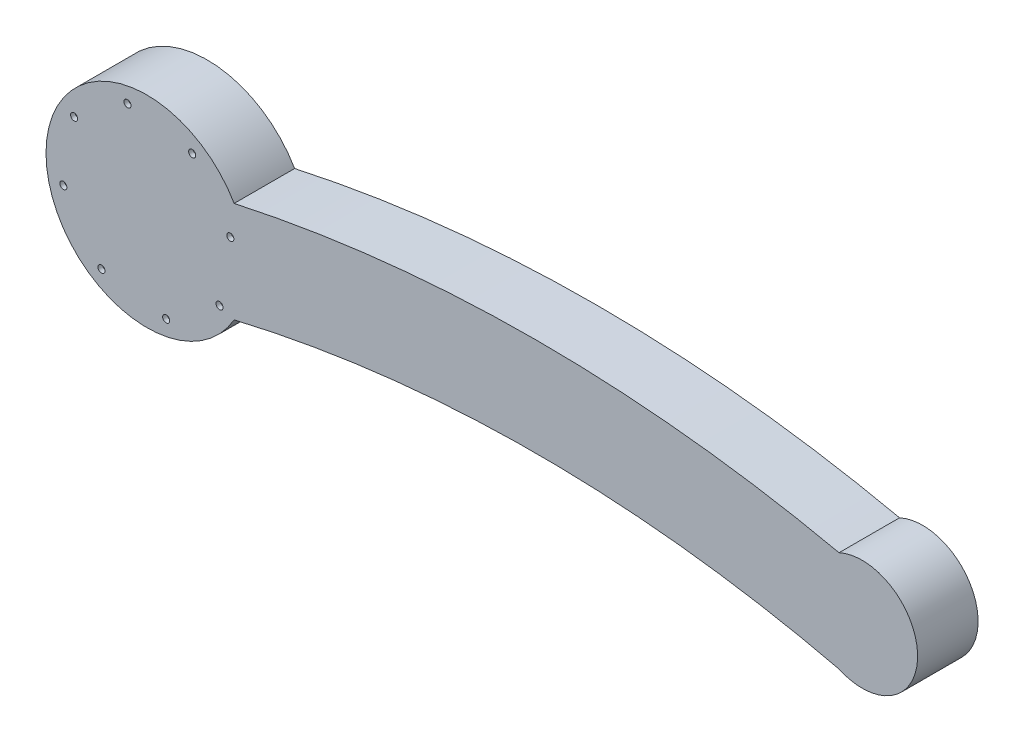
ISO-10303-21;
HEADER;
FILE_DESCRIPTION(('STEP AP214'),'2;1');
FILE_NAME('part.step','',(''),(''),'','','');
FILE_SCHEMA(('AUTOMOTIVE_DESIGN { 1 0 10303 214 1 1 1 1 }'));
ENDSEC;
DATA;
#1=APPLICATION_CONTEXT('core data for automotive mechanical design processes');
#2=APPLICATION_PROTOCOL_DEFINITION('international standard','automotive_design',2000,#1);
#3=PRODUCT_CONTEXT('',#1,'mechanical');
#4=PRODUCT('Part','Part','',(#3));
#5=PRODUCT_RELATED_PRODUCT_CATEGORY('part','',(#4));
#6=PRODUCT_DEFINITION_FORMATION('','',#4);
#7=PRODUCT_DEFINITION_CONTEXT('part definition',#1,'design');
#8=PRODUCT_DEFINITION('design','',#6,#7);
#9=PRODUCT_DEFINITION_SHAPE('','',#8);
#10=(LENGTH_UNIT() NAMED_UNIT(*) SI_UNIT(.MILLI.,.METRE.));
#11=(NAMED_UNIT(*) PLANE_ANGLE_UNIT() SI_UNIT($,.RADIAN.));
#12=(NAMED_UNIT(*) SI_UNIT($,.STERADIAN.) SOLID_ANGLE_UNIT());
#13=UNCERTAINTY_MEASURE_WITH_UNIT(LENGTH_MEASURE(1.E-05),#10,'distance_accuracy_value','');
#14=(GEOMETRIC_REPRESENTATION_CONTEXT(3) GLOBAL_UNCERTAINTY_ASSIGNED_CONTEXT((#13)) GLOBAL_UNIT_ASSIGNED_CONTEXT((#10,
#11,#12)) REPRESENTATION_CONTEXT('',''));
#15=CARTESIAN_POINT('',(0.,0.,0.));
#16=DIRECTION('',(0.,0.,1.));
#17=DIRECTION('',(1.,0.,0.));
#18=AXIS2_PLACEMENT_3D('',#15,#16,#17);
#19=CARTESIAN_POINT('',(161.45643923739,0.,30.));
#20=DIRECTION('',(0.,0.,-1.));
#21=DIRECTION('',(-1.,0.,0.));
#22=AXIS2_PLACEMENT_3D('',#19,#20,#21);
#23=CYLINDRICAL_SURFACE('',#22,27.5);
#24=CARTESIAN_POINT('',(161.45643923739,0.,0.));
#25=DIRECTION('',(0.,0.,1.));
#26=DIRECTION('',(1.,0.,0.));
#27=AXIS2_PLACEMENT_3D('',#24,#25,#26);
#28=CIRCLE('',#27,27.5);
#29=CARTESIAN_POINT('',(150.,-25.,0.));
#30=VERTEX_POINT('',#29);
#31=CARTESIAN_POINT('',(150.,25.,0.));
#32=VERTEX_POINT('',#31);
#33=EDGE_CURVE('E147',#30,#32,#28,.T.);
#34=ORIENTED_EDGE('',*,*,#33,.T.);
#35=DIRECTION('',(0.,0.,-1.));
#36=VECTOR('',#35,1.);
#37=CARTESIAN_POINT('',(150.,25.,30.));
#38=LINE('',#37,#36);
#39=CARTESIAN_POINT('',(150.,25.,30.));
#40=VERTEX_POINT('',#39);
#41=EDGE_CURVE('E11',#40,#32,#38,.T.);
#42=ORIENTED_EDGE('',*,*,#41,.F.);
#43=CARTESIAN_POINT('',(161.45643923739,0.,30.));
#44=DIRECTION('',(0.,0.,1.));
#45=DIRECTION('',(1.,0.,0.));
#46=AXIS2_PLACEMENT_3D('',#43,#44,#45);
#47=CIRCLE('',#46,27.5);
#48=CARTESIAN_POINT('',(150.,-25.,30.));
#49=VERTEX_POINT('',#48);
#50=EDGE_CURVE('E89',#49,#40,#47,.T.);
#51=ORIENTED_EDGE('',*,*,#50,.F.);
#52=DIRECTION('',(0.,0.,-1.));
#53=VECTOR('',#52,1.);
#54=CARTESIAN_POINT('',(150.,-25.,30.));
#55=LINE('',#54,#53);
#56=EDGE_CURVE('E158',#49,#30,#55,.T.);
#57=ORIENTED_EDGE('',*,*,#56,.T.);
#58=EDGE_LOOP('',(#34,#42,#51,#57));
#59=FACE_BOUND('',#58,.T.);
#60=ADVANCED_FACE('F41',(#59),#23,.T.);
#61=CARTESIAN_POINT('',(0.,-658.739716558867,30.));
#62=DIRECTION('',(0.,0.,-1.));
#63=DIRECTION('',(-1.,0.,0.));
#64=AXIS2_PLACEMENT_3D('',#61,#62,#63);
#65=CYLINDRICAL_SURFACE('',#64,700.);
#66=CARTESIAN_POINT('',(0.,-658.739716558867,0.));
#67=DIRECTION('',(0.,0.,1.));
#68=DIRECTION('',(1.,0.,0.));
#69=AXIS2_PLACEMENT_3D('',#66,#67,#68);
#70=CIRCLE('',#69,700.);
#71=CARTESIAN_POINT('',(-150.,25.,0.));
#72=VERTEX_POINT('',#71);
#73=EDGE_CURVE('E161',#72,#32,#70,.F.);
#74=ORIENTED_EDGE('',*,*,#73,.F.);
#75=DIRECTION('',(0.,0.,-1.));
#76=VECTOR('',#75,1.);
#77=CARTESIAN_POINT('',(-150.,25.,30.));
#78=LINE('',#77,#76);
#79=CARTESIAN_POINT('',(-150.,25.,30.));
#80=VERTEX_POINT('',#79);
#81=EDGE_CURVE('E48',#80,#72,#78,.T.);
#82=ORIENTED_EDGE('',*,*,#81,.F.);
#83=CARTESIAN_POINT('',(0.,-658.739716558867,30.));
#84=DIRECTION('',(0.,0.,1.));
#85=DIRECTION('',(1.,0.,0.));
#86=AXIS2_PLACEMENT_3D('',#83,#84,#85);
#87=CIRCLE('',#86,700.);
#88=EDGE_CURVE('E152',#80,#40,#87,.F.);
#89=ORIENTED_EDGE('',*,*,#88,.T.);
#90=ORIENTED_EDGE('',*,*,#41,.T.);
#91=EDGE_LOOP('',(#74,#82,#89,#90));
#92=FACE_BOUND('',#91,.T.);
#93=ADVANCED_FACE('F179',(#92),#65,.T.);
#94=CARTESIAN_POINT('',(-193.301270189222,0.,30.));
#95=DIRECTION('',(0.,0.,-1.));
#96=DIRECTION('',(-1.,0.,0.));
#97=AXIS2_PLACEMENT_3D('',#94,#95,#96);
#98=CYLINDRICAL_SURFACE('',#97,50.);
#99=CARTESIAN_POINT('',(-193.301270189222,0.,0.));
#100=DIRECTION('',(0.,0.,1.));
#101=DIRECTION('',(1.,0.,0.));
#102=AXIS2_PLACEMENT_3D('',#99,#100,#101);
#103=CIRCLE('',#102,50.);
#104=CARTESIAN_POINT('',(-150.,-25.,0.));
#105=VERTEX_POINT('',#104);
#106=EDGE_CURVE('E164',#72,#105,#103,.T.);
#107=ORIENTED_EDGE('',*,*,#106,.T.);
#108=DIRECTION('',(0.,0.,-1.));
#109=VECTOR('',#108,1.);
#110=CARTESIAN_POINT('',(-150.,-25.,30.));
#111=LINE('',#110,#109);
#112=CARTESIAN_POINT('',(-150.,-25.,30.));
#113=VERTEX_POINT('',#112);
#114=EDGE_CURVE('E168',#113,#105,#111,.T.);
#115=ORIENTED_EDGE('',*,*,#114,.F.);
#116=CARTESIAN_POINT('',(-193.301270189222,0.,30.));
#117=DIRECTION('',(0.,0.,1.));
#118=DIRECTION('',(1.,0.,0.));
#119=AXIS2_PLACEMENT_3D('',#116,#117,#118);
#120=CIRCLE('',#119,50.);
#121=EDGE_CURVE('E155',#80,#113,#120,.T.);
#122=ORIENTED_EDGE('',*,*,#121,.F.);
#123=ORIENTED_EDGE('',*,*,#81,.T.);
#124=EDGE_LOOP('',(#107,#115,#122,#123));
#125=FACE_BOUND('',#124,.T.);
#126=ADVANCED_FACE('F172',(#125),#98,.T.);
#127=CARTESIAN_POINT('',(0.,-657.455532033676,30.));
#128=DIRECTION('',(0.,0.,-1.));
#129=DIRECTION('',(-1.,0.,0.));
#130=AXIS2_PLACEMENT_3D('',#127,#128,#129);
#131=CYLINDRICAL_SURFACE('',#130,650.);
#132=CARTESIAN_POINT('',(0.,-657.455532033676,0.));
#133=DIRECTION('',(0.,0.,1.));
#134=DIRECTION('',(1.,0.,0.));
#135=AXIS2_PLACEMENT_3D('',#132,#133,#134);
#136=CIRCLE('',#135,650.);
#137=EDGE_CURVE('E84',#105,#30,#136,.F.);
#138=ORIENTED_EDGE('',*,*,#137,.T.);
#139=ORIENTED_EDGE('',*,*,#56,.F.);
#140=CARTESIAN_POINT('',(0.,-657.455532033676,30.));
#141=DIRECTION('',(0.,0.,1.));
#142=DIRECTION('',(1.,0.,0.));
#143=AXIS2_PLACEMENT_3D('',#140,#141,#142);
#144=CIRCLE('',#143,650.);
#145=EDGE_CURVE('E64',#113,#49,#144,.F.);
#146=ORIENTED_EDGE('',*,*,#145,.F.);
#147=ORIENTED_EDGE('',*,*,#114,.T.);
#148=EDGE_LOOP('',(#138,#139,#146,#147));
#149=FACE_BOUND('',#148,.T.);
#150=ADVANCED_FACE('F181',(#149),#131,.F.);
#151=CARTESIAN_POINT('',(0.,0.,30.));
#152=DIRECTION('',(0.,0.,1.));
#153=DIRECTION('',(1.,0.,0.));
#154=AXIS2_PLACEMENT_3D('',#151,#152,#153);
#155=PLANE('',#154);
#156=CARTESIAN_POINT('',(-151.896300525084,9.58532665650083,30.));
#157=DIRECTION('',(0.,0.,-1.));
#158=DIRECTION('',(-1.,0.,0.));
#159=AXIS2_PLACEMENT_3D('',#156,#157,#158);
#160=CIRCLE('',#159,1.75000000000001);
#161=CARTESIAN_POINT('',(-153.646300525084,9.58532665650083,30.));
#162=VERTEX_POINT('',#161);
#163=EDGE_CURVE('E143',#162,#162,#160,.T.);
#164=ORIENTED_EDGE('',*,*,#163,.T.);
#165=EDGE_LOOP('',(#164));
#166=FACE_BOUND('',#165,.T.);
#167=CARTESIAN_POINT('',(-157.245685886187,-22.4998853456347,30.));
#168=DIRECTION('',(0.,0.,-1.));
#169=DIRECTION('',(-1.,0.,0.));
#170=AXIS2_PLACEMENT_3D('',#167,#168,#169);
#171=CIRCLE('',#170,1.75);
#172=CARTESIAN_POINT('',(-158.995685886187,-22.4998853456347,30.));
#173=VERTEX_POINT('',#172);
#174=EDGE_CURVE('E378',#173,#173,#171,.T.);
#175=ORIENTED_EDGE('',*,*,#174,.T.);
#176=EDGE_LOOP('',(#175));
#177=FACE_BOUND('',#176,.T.);
#178=CARTESIAN_POINT('',(-183.715943532721,-41.4049696641373,30.));
#179=DIRECTION('',(0.,0.,-1.));
#180=DIRECTION('',(-1.,0.,0.));
#181=AXIS2_PLACEMENT_3D('',#178,#179,#180);
#182=CIRCLE('',#181,1.75);
#183=CARTESIAN_POINT('',(-185.465943532721,-41.4049696641373,30.));
#184=VERTEX_POINT('',#183);
#185=EDGE_CURVE('E386',#184,#184,#182,.T.);
#186=ORIENTED_EDGE('',*,*,#185,.T.);
#187=EDGE_LOOP('',(#186));
#188=FACE_BOUND('',#187,.T.);
#189=CARTESIAN_POINT('',(-215.801155534857,-36.0555843030344,30.));
#190=DIRECTION('',(0.,0.,-1.));
#191=DIRECTION('',(-1.,0.,0.));
#192=AXIS2_PLACEMENT_3D('',#189,#190,#191);
#193=CIRCLE('',#192,1.75000000000002);
#194=CARTESIAN_POINT('',(-217.551155534858,-36.0555843030344,30.));
#195=VERTEX_POINT('',#194);
#196=EDGE_CURVE('E392',#195,#195,#193,.T.);
#197=ORIENTED_EDGE('',*,*,#196,.T.);
#198=EDGE_LOOP('',(#197));
#199=FACE_BOUND('',#198,.T.);
#200=CARTESIAN_POINT('',(-234.70623985336,-9.58532665649994,30.));
#201=DIRECTION('',(0.,0.,-1.));
#202=DIRECTION('',(-1.,0.,0.));
#203=AXIS2_PLACEMENT_3D('',#200,#201,#202);
#204=CIRCLE('',#203,1.75000000000003);
#205=CARTESIAN_POINT('',(-236.45623985336,-9.58532665649994,30.));
#206=VERTEX_POINT('',#205);
#207=EDGE_CURVE('E398',#206,#206,#204,.T.);
#208=ORIENTED_EDGE('',*,*,#207,.T.);
#209=EDGE_LOOP('',(#208));
#210=FACE_BOUND('',#209,.T.);
#211=CARTESIAN_POINT('',(-229.356854492257,22.4998853456361,30.));
#212=DIRECTION('',(0.,0.,-1.));
#213=DIRECTION('',(-1.,0.,0.));
#214=AXIS2_PLACEMENT_3D('',#211,#212,#213);
#215=CIRCLE('',#214,1.75000000000001);
#216=CARTESIAN_POINT('',(-231.106854492257,22.4998853456361,30.));
#217=VERTEX_POINT('',#216);
#218=EDGE_CURVE('E404',#217,#217,#215,.T.);
#219=ORIENTED_EDGE('',*,*,#218,.T.);
#220=EDGE_LOOP('',(#219));
#221=FACE_BOUND('',#220,.T.);
#222=CARTESIAN_POINT('',(-202.886596845722,41.4049696641386,30.));
#223=DIRECTION('',(0.,0.,-1.));
#224=DIRECTION('',(-1.,0.,0.));
#225=AXIS2_PLACEMENT_3D('',#222,#223,#224);
#226=CIRCLE('',#225,1.75000000000001);
#227=CARTESIAN_POINT('',(-204.636596845722,41.4049696641386,30.));
#228=VERTEX_POINT('',#227);
#229=EDGE_CURVE('E410',#228,#228,#226,.T.);
#230=ORIENTED_EDGE('',*,*,#229,.T.);
#231=EDGE_LOOP('',(#230));
#232=FACE_BOUND('',#231,.T.);
#233=CARTESIAN_POINT('',(-170.801384843586,36.0555843030354,30.));
#234=DIRECTION('',(0.,0.,-1.));
#235=DIRECTION('',(-1.,0.,0.));
#236=AXIS2_PLACEMENT_3D('',#233,#234,#235);
#237=CIRCLE('',#236,1.75000000000001);
#238=CARTESIAN_POINT('',(-172.551384843586,36.0555843030354,30.));
#239=VERTEX_POINT('',#238);
#240=EDGE_CURVE('E415',#239,#239,#237,.T.);
#241=ORIENTED_EDGE('',*,*,#240,.T.);
#242=EDGE_LOOP('',(#241));
#243=FACE_BOUND('',#242,.T.);
#244=ORIENTED_EDGE('',*,*,#50,.T.);
#245=ORIENTED_EDGE('',*,*,#88,.F.);
#246=ORIENTED_EDGE('',*,*,#121,.T.);
#247=ORIENTED_EDGE('',*,*,#145,.T.);
#248=EDGE_LOOP('',(#244,#245,#246,#247));
#249=FACE_BOUND('',#248,.T.);
#250=ADVANCED_FACE('F183',(#166,#177,#188,#199,#210,#221,#232,#243,#249),#155,.T.);
#251=CARTESIAN_POINT('',(0.,0.,0.));
#252=DIRECTION('',(0.,0.,1.));
#253=DIRECTION('',(1.,0.,0.));
#254=AXIS2_PLACEMENT_3D('',#251,#252,#253);
#255=PLANE('',#254);
#256=DIRECTION('',(0.225537097800018,-0.974234580332655,0.));
#257=VECTOR('',#256,1.);
#258=CARTESIAN_POINT('',(-228.526967204746,-52.9044133650023,0.));
#259=LINE('',#258,#257);
#260=CARTESIAN_POINT('',(-241.460241997675,2.9624203538032,0.));
#261=VERTEX_POINT('',#260);
#262=CARTESIAN_POINT('',(-235.258997061539,-23.8246019003048,0.));
#263=VERTEX_POINT('',#262);
#264=EDGE_CURVE('E142',#261,#263,#259,.T.);
#265=ORIENTED_EDGE('',*,*,#264,.T.);
#266=CARTESIAN_POINT('',(-193.301270189222,0.,0.));
#267=DIRECTION('',(0.,0.,-1.));
#268=DIRECTION('',(-1.,0.,0.));
#269=AXIS2_PLACEMENT_3D('',#266,#267,#268);
#270=CIRCLE('',#269,48.25);
#271=CARTESIAN_POINT('',(-145.115292458583,-2.48476359889796,0.));
#272=VERTEX_POINT('',#271);
#273=EDGE_CURVE('E55',#272,#263,#270,.T.);
#274=ORIENTED_EDGE('',*,*,#273,.F.);
#275=DIRECTION('',(0.225537097800018,-0.974234580332655,0.));
#276=VECTOR('',#275,1.);
#277=CARTESIAN_POINT('',(-138.27968268441,-32.012000956382,0.));
#278=LINE('',#277,#276);
#279=CARTESIAN_POINT('',(-151.109377559959,23.4074068696373,0.));
#280=VERTEX_POINT('',#279);
#281=EDGE_CURVE('E133',#280,#272,#278,.T.);
#282=ORIENTED_EDGE('',*,*,#281,.F.);
#283=EDGE_CURVE('E136',#261,#280,#270,.T.);
#284=ORIENTED_EDGE('',*,*,#283,.F.);
#285=EDGE_LOOP('',(#265,#274,#282,#284));
#286=FACE_BOUND('',#285,.T.);
#287=ORIENTED_EDGE('',*,*,#33,.F.);
#288=ORIENTED_EDGE('',*,*,#137,.F.);
#289=ORIENTED_EDGE('',*,*,#106,.F.);
#290=ORIENTED_EDGE('',*,*,#73,.T.);
#291=EDGE_LOOP('',(#287,#288,#289,#290));
#292=FACE_BOUND('',#291,.T.);
#293=ADVANCED_FACE('F178',(#286,#292),#255,.F.);
#294=CARTESIAN_POINT('',(-193.301270189222,0.,27.75));
#295=DIRECTION('',(0.,0.,-1.));
#296=DIRECTION('',(-1.,0.,0.));
#297=AXIS2_PLACEMENT_3D('',#294,#295,#296);
#298=CYLINDRICAL_SURFACE('',#297,48.25);
#299=ORIENTED_EDGE('',*,*,#273,.T.);
#300=DIRECTION('',(0.,0.,-1.));
#301=VECTOR('',#300,1.);
#302=CARTESIAN_POINT('',(-235.258997061539,-23.8246019003048,27.75));
#303=LINE('',#302,#301);
#304=CARTESIAN_POINT('',(-235.258997061539,-23.8246019003048,27.75));
#305=VERTEX_POINT('',#304);
#306=EDGE_CURVE('E116',#305,#263,#303,.T.);
#307=ORIENTED_EDGE('',*,*,#306,.F.);
#308=CARTESIAN_POINT('',(-193.301270189222,0.,27.75));
#309=DIRECTION('',(0.,0.,-1.));
#310=DIRECTION('',(-1.,0.,0.));
#311=AXIS2_PLACEMENT_3D('',#308,#309,#310);
#312=CIRCLE('',#311,48.25);
#313=CARTESIAN_POINT('',(-145.115292458583,-2.48476359889796,27.75));
#314=VERTEX_POINT('',#313);
#315=EDGE_CURVE('E124',#314,#305,#312,.T.);
#316=ORIENTED_EDGE('',*,*,#315,.F.);
#317=DIRECTION('',(0.,0.,-1.));
#318=VECTOR('',#317,1.);
#319=CARTESIAN_POINT('',(-145.115292458583,-2.48476359889796,27.75));
#320=LINE('',#319,#318);
#321=EDGE_CURVE('E145',#314,#272,#320,.T.);
#322=ORIENTED_EDGE('',*,*,#321,.T.);
#323=EDGE_LOOP('',(#299,#307,#316,#322));
#324=FACE_BOUND('',#323,.T.);
#325=ADVANCED_FACE('F127',(#324),#298,.F.);
#326=CARTESIAN_POINT('',(-138.27968268441,-32.012000956382,27.75));
#327=DIRECTION('',(0.974234580332655,0.225537097800018,0.));
#328=DIRECTION('',(-0.225537097800018,0.974234580332655,0.));
#329=AXIS2_PLACEMENT_3D('',#326,#327,#328);
#330=PLANE('',#329);
#331=ORIENTED_EDGE('',*,*,#281,.T.);
#332=ORIENTED_EDGE('',*,*,#321,.F.);
#333=DIRECTION('',(0.225537097800018,-0.974234580332655,0.));
#334=VECTOR('',#333,1.);
#335=CARTESIAN_POINT('',(-138.27968268441,-32.012000956382,27.75));
#336=LINE('',#335,#334);
#337=CARTESIAN_POINT('',(-151.109377559959,23.4074068696373,27.75));
#338=VERTEX_POINT('',#337);
#339=EDGE_CURVE('E129',#338,#314,#336,.T.);
#340=ORIENTED_EDGE('',*,*,#339,.F.);
#341=DIRECTION('',(0.,0.,-1.));
#342=VECTOR('',#341,1.);
#343=CARTESIAN_POINT('',(-151.109377559959,23.4074068696373,27.75));
#344=LINE('',#343,#342);
#345=EDGE_CURVE('E148',#338,#280,#344,.T.);
#346=ORIENTED_EDGE('',*,*,#345,.T.);
#347=EDGE_LOOP('',(#331,#332,#340,#346));
#348=FACE_BOUND('',#347,.T.);
#349=ADVANCED_FACE('F252',(#348),#330,.F.);
#350=ORIENTED_EDGE('',*,*,#283,.T.);
#351=ORIENTED_EDGE('',*,*,#345,.F.);
#352=CARTESIAN_POINT('',(-241.460241997675,2.9624203538032,27.75));
#353=VERTEX_POINT('',#352);
#354=EDGE_CURVE('E123',#353,#338,#312,.T.);
#355=ORIENTED_EDGE('',*,*,#354,.F.);
#356=DIRECTION('',(0.,0.,-1.));
#357=VECTOR('',#356,1.);
#358=CARTESIAN_POINT('',(-241.460241997675,2.9624203538032,27.75));
#359=LINE('',#358,#357);
#360=EDGE_CURVE('E118',#353,#261,#359,.T.);
#361=ORIENTED_EDGE('',*,*,#360,.T.);
#362=EDGE_LOOP('',(#350,#351,#355,#361));
#363=FACE_BOUND('',#362,.T.);
#364=ADVANCED_FACE('F254',(#363),#298,.F.);
#365=CARTESIAN_POINT('',(-228.526967204746,-52.9044133650023,27.75));
#366=DIRECTION('',(0.974234580332655,0.225537097800018,0.));
#367=DIRECTION('',(-0.225537097800018,0.974234580332655,0.));
#368=AXIS2_PLACEMENT_3D('',#365,#366,#367);
#369=PLANE('',#368);
#370=ORIENTED_EDGE('',*,*,#264,.F.);
#371=ORIENTED_EDGE('',*,*,#360,.F.);
#372=DIRECTION('',(0.225537097800018,-0.974234580332655,0.));
#373=VECTOR('',#372,1.);
#374=CARTESIAN_POINT('',(-228.526967204746,-52.9044133650023,27.75));
#375=LINE('',#374,#373);
#376=EDGE_CURVE('E113',#353,#305,#375,.T.);
#377=ORIENTED_EDGE('',*,*,#376,.T.);
#378=ORIENTED_EDGE('',*,*,#306,.T.);
#379=EDGE_LOOP('',(#370,#371,#377,#378));
#380=FACE_BOUND('',#379,.T.);
#381=ADVANCED_FACE('F115',(#380),#369,.T.);
#382=CARTESIAN_POINT('',(0.,0.,27.75));
#383=DIRECTION('',(0.,0.,-1.));
#384=DIRECTION('',(-1.,0.,0.));
#385=AXIS2_PLACEMENT_3D('',#382,#383,#384);
#386=PLANE('',#385);
#387=CARTESIAN_POINT('',(-151.896300525084,9.58532665650083,27.75));
#388=DIRECTION('',(0.,0.,-1.));
#389=DIRECTION('',(-1.,0.,0.));
#390=AXIS2_PLACEMENT_3D('',#387,#388,#389);
#391=CIRCLE('',#390,1.75000000000001);
#392=CARTESIAN_POINT('',(-153.646300525084,9.58532665650083,27.75));
#393=VERTEX_POINT('',#392);
#394=EDGE_CURVE('E373',#393,#393,#391,.T.);
#395=ORIENTED_EDGE('',*,*,#394,.F.);
#396=EDGE_LOOP('',(#395));
#397=FACE_BOUND('',#396,.T.);
#398=CARTESIAN_POINT('',(-157.245685886187,-22.4998853456347,27.75));
#399=DIRECTION('',(0.,0.,-1.));
#400=DIRECTION('',(-1.,0.,0.));
#401=AXIS2_PLACEMENT_3D('',#398,#399,#400);
#402=CIRCLE('',#401,1.75);
#403=CARTESIAN_POINT('',(-158.995685886187,-22.4998853456347,27.75));
#404=VERTEX_POINT('',#403);
#405=EDGE_CURVE('E374',#404,#404,#402,.T.);
#406=ORIENTED_EDGE('',*,*,#405,.F.);
#407=EDGE_LOOP('',(#406));
#408=FACE_BOUND('',#407,.T.);
#409=CARTESIAN_POINT('',(-183.715943532721,-41.4049696641373,27.75));
#410=DIRECTION('',(0.,0.,-1.));
#411=DIRECTION('',(-1.,0.,0.));
#412=AXIS2_PLACEMENT_3D('',#409,#410,#411);
#413=CIRCLE('',#412,1.75);
#414=CARTESIAN_POINT('',(-185.465943532721,-41.4049696641373,27.75));
#415=VERTEX_POINT('',#414);
#416=EDGE_CURVE('E383',#415,#415,#413,.T.);
#417=ORIENTED_EDGE('',*,*,#416,.F.);
#418=EDGE_LOOP('',(#417));
#419=FACE_BOUND('',#418,.T.);
#420=CARTESIAN_POINT('',(-215.801155534857,-36.0555843030344,27.75));
#421=DIRECTION('',(0.,0.,-1.));
#422=DIRECTION('',(-1.,0.,0.));
#423=AXIS2_PLACEMENT_3D('',#420,#421,#422);
#424=CIRCLE('',#423,1.75000000000002);
#425=CARTESIAN_POINT('',(-217.551155534858,-36.0555843030344,27.75));
#426=VERTEX_POINT('',#425);
#427=EDGE_CURVE('E389',#426,#426,#424,.T.);
#428=ORIENTED_EDGE('',*,*,#427,.F.);
#429=EDGE_LOOP('',(#428));
#430=FACE_BOUND('',#429,.T.);
#431=CARTESIAN_POINT('',(-234.70623985336,-9.58532665649994,27.75));
#432=DIRECTION('',(0.,0.,-1.));
#433=DIRECTION('',(-1.,0.,0.));
#434=AXIS2_PLACEMENT_3D('',#431,#432,#433);
#435=CIRCLE('',#434,1.75000000000003);
#436=CARTESIAN_POINT('',(-236.45623985336,-9.58532665649994,27.75));
#437=VERTEX_POINT('',#436);
#438=EDGE_CURVE('E395',#437,#437,#435,.T.);
#439=ORIENTED_EDGE('',*,*,#438,.F.);
#440=EDGE_LOOP('',(#439));
#441=FACE_BOUND('',#440,.T.);
#442=CARTESIAN_POINT('',(-229.356854492257,22.4998853456361,27.75));
#443=DIRECTION('',(0.,0.,-1.));
#444=DIRECTION('',(-1.,0.,0.));
#445=AXIS2_PLACEMENT_3D('',#442,#443,#444);
#446=CIRCLE('',#445,1.75000000000001);
#447=CARTESIAN_POINT('',(-231.106854492257,22.4998853456361,27.75));
#448=VERTEX_POINT('',#447);
#449=EDGE_CURVE('E401',#448,#448,#446,.T.);
#450=ORIENTED_EDGE('',*,*,#449,.F.);
#451=EDGE_LOOP('',(#450));
#452=FACE_BOUND('',#451,.T.);
#453=CARTESIAN_POINT('',(-202.886596845722,41.4049696641386,27.75));
#454=DIRECTION('',(0.,0.,-1.));
#455=DIRECTION('',(-1.,0.,0.));
#456=AXIS2_PLACEMENT_3D('',#453,#454,#455);
#457=CIRCLE('',#456,1.75000000000001);
#458=CARTESIAN_POINT('',(-204.636596845722,41.4049696641386,27.75));
#459=VERTEX_POINT('',#458);
#460=EDGE_CURVE('E407',#459,#459,#457,.T.);
#461=ORIENTED_EDGE('',*,*,#460,.F.);
#462=EDGE_LOOP('',(#461));
#463=FACE_BOUND('',#462,.T.);
#464=CARTESIAN_POINT('',(-170.801384843586,36.0555843030354,27.75));
#465=DIRECTION('',(0.,0.,-1.));
#466=DIRECTION('',(-1.,0.,0.));
#467=AXIS2_PLACEMENT_3D('',#464,#465,#466);
#468=CIRCLE('',#467,1.75000000000001);
#469=CARTESIAN_POINT('',(-172.551384843586,36.0555843030354,27.75));
#470=VERTEX_POINT('',#469);
#471=EDGE_CURVE('E413',#470,#470,#468,.T.);
#472=ORIENTED_EDGE('',*,*,#471,.F.);
#473=EDGE_LOOP('',(#472));
#474=FACE_BOUND('',#473,.T.);
#475=ORIENTED_EDGE('',*,*,#315,.T.);
#476=ORIENTED_EDGE('',*,*,#376,.F.);
#477=ORIENTED_EDGE('',*,*,#354,.T.);
#478=ORIENTED_EDGE('',*,*,#339,.T.);
#479=EDGE_LOOP('',(#475,#476,#477,#478));
#480=FACE_BOUND('',#479,.T.);
#481=ADVANCED_FACE('F131',(#397,#408,#419,#430,#441,#452,#463,#474,#480),#386,.T.);
#482=CARTESIAN_POINT('',(-170.801384843586,36.0555843030354,30.));
#483=DIRECTION('',(0.,0.,-1.));
#484=DIRECTION('',(-1.,0.,0.));
#485=AXIS2_PLACEMENT_3D('',#482,#483,#484);
#486=CYLINDRICAL_SURFACE('',#485,1.75000000000001);
#487=ORIENTED_EDGE('',*,*,#240,.F.);
#488=EDGE_LOOP('',(#487));
#489=FACE_BOUND('',#488,.T.);
#490=ORIENTED_EDGE('',*,*,#471,.T.);
#491=EDGE_LOOP('',(#490));
#492=FACE_BOUND('',#491,.T.);
#493=ADVANCED_FACE('F285',(#489,#492),#486,.F.);
#494=CARTESIAN_POINT('',(-202.886596845722,41.4049696641386,30.));
#495=DIRECTION('',(0.,0.,-1.));
#496=DIRECTION('',(-1.,0.,0.));
#497=AXIS2_PLACEMENT_3D('',#494,#495,#496);
#498=CYLINDRICAL_SURFACE('',#497,1.75000000000001);
#499=ORIENTED_EDGE('',*,*,#229,.F.);
#500=EDGE_LOOP('',(#499));
#501=FACE_BOUND('',#500,.T.);
#502=ORIENTED_EDGE('',*,*,#460,.T.);
#503=EDGE_LOOP('',(#502));
#504=FACE_BOUND('',#503,.T.);
#505=ADVANCED_FACE('F295',(#501,#504),#498,.F.);
#506=CARTESIAN_POINT('',(-229.356854492257,22.4998853456361,30.));
#507=DIRECTION('',(0.,0.,-1.));
#508=DIRECTION('',(-1.,0.,0.));
#509=AXIS2_PLACEMENT_3D('',#506,#507,#508);
#510=CYLINDRICAL_SURFACE('',#509,1.75000000000001);
#511=ORIENTED_EDGE('',*,*,#218,.F.);
#512=EDGE_LOOP('',(#511));
#513=FACE_BOUND('',#512,.T.);
#514=ORIENTED_EDGE('',*,*,#449,.T.);
#515=EDGE_LOOP('',(#514));
#516=FACE_BOUND('',#515,.T.);
#517=ADVANCED_FACE('F305',(#513,#516),#510,.F.);
#518=CARTESIAN_POINT('',(-234.70623985336,-9.58532665649994,30.));
#519=DIRECTION('',(0.,0.,-1.));
#520=DIRECTION('',(-1.,0.,0.));
#521=AXIS2_PLACEMENT_3D('',#518,#519,#520);
#522=CYLINDRICAL_SURFACE('',#521,1.75000000000003);
#523=ORIENTED_EDGE('',*,*,#207,.F.);
#524=EDGE_LOOP('',(#523));
#525=FACE_BOUND('',#524,.T.);
#526=ORIENTED_EDGE('',*,*,#438,.T.);
#527=EDGE_LOOP('',(#526));
#528=FACE_BOUND('',#527,.T.);
#529=ADVANCED_FACE('F315',(#525,#528),#522,.F.);
#530=CARTESIAN_POINT('',(-215.801155534857,-36.0555843030344,30.));
#531=DIRECTION('',(0.,0.,-1.));
#532=DIRECTION('',(-1.,0.,0.));
#533=AXIS2_PLACEMENT_3D('',#530,#531,#532);
#534=CYLINDRICAL_SURFACE('',#533,1.75000000000002);
#535=ORIENTED_EDGE('',*,*,#196,.F.);
#536=EDGE_LOOP('',(#535));
#537=FACE_BOUND('',#536,.T.);
#538=ORIENTED_EDGE('',*,*,#427,.T.);
#539=EDGE_LOOP('',(#538));
#540=FACE_BOUND('',#539,.T.);
#541=ADVANCED_FACE('F325',(#537,#540),#534,.F.);
#542=CARTESIAN_POINT('',(-183.715943532721,-41.4049696641373,30.));
#543=DIRECTION('',(0.,0.,-1.));
#544=DIRECTION('',(-1.,0.,0.));
#545=AXIS2_PLACEMENT_3D('',#542,#543,#544);
#546=CYLINDRICAL_SURFACE('',#545,1.75);
#547=ORIENTED_EDGE('',*,*,#185,.F.);
#548=EDGE_LOOP('',(#547));
#549=FACE_BOUND('',#548,.T.);
#550=ORIENTED_EDGE('',*,*,#416,.T.);
#551=EDGE_LOOP('',(#550));
#552=FACE_BOUND('',#551,.T.);
#553=ADVANCED_FACE('F335',(#549,#552),#546,.F.);
#554=CARTESIAN_POINT('',(-157.245685886187,-22.4998853456347,30.));
#555=DIRECTION('',(0.,0.,-1.));
#556=DIRECTION('',(-1.,0.,0.));
#557=AXIS2_PLACEMENT_3D('',#554,#555,#556);
#558=CYLINDRICAL_SURFACE('',#557,1.75);
#559=ORIENTED_EDGE('',*,*,#174,.F.);
#560=EDGE_LOOP('',(#559));
#561=FACE_BOUND('',#560,.T.);
#562=ORIENTED_EDGE('',*,*,#405,.T.);
#563=EDGE_LOOP('',(#562));
#564=FACE_BOUND('',#563,.T.);
#565=ADVANCED_FACE('F345',(#561,#564),#558,.F.);
#566=CARTESIAN_POINT('',(-151.896300525084,9.58532665650083,30.));
#567=DIRECTION('',(0.,0.,-1.));
#568=DIRECTION('',(-1.,0.,0.));
#569=AXIS2_PLACEMENT_3D('',#566,#567,#568);
#570=CYLINDRICAL_SURFACE('',#569,1.75000000000001);
#571=ORIENTED_EDGE('',*,*,#163,.F.);
#572=EDGE_LOOP('',(#571));
#573=FACE_BOUND('',#572,.T.);
#574=ORIENTED_EDGE('',*,*,#394,.T.);
#575=EDGE_LOOP('',(#574));
#576=FACE_BOUND('',#575,.T.);
#577=ADVANCED_FACE('F355',(#573,#576),#570,.F.);
#578=CLOSED_SHELL('',(#60,#93,#126,#150,#250,#293,#325,#349,#364,#381,#481,#493,#505,#517,#529,
#541,#553,#565,#577));
#579=MANIFOLD_SOLID_BREP('B2',#578);
#580=ADVANCED_BREP_SHAPE_REPRESENTATION('',(#18,#579),#14);
#581=SHAPE_DEFINITION_REPRESENTATION(#9,#580);
ENDSEC;
END-ISO-10303-21;
